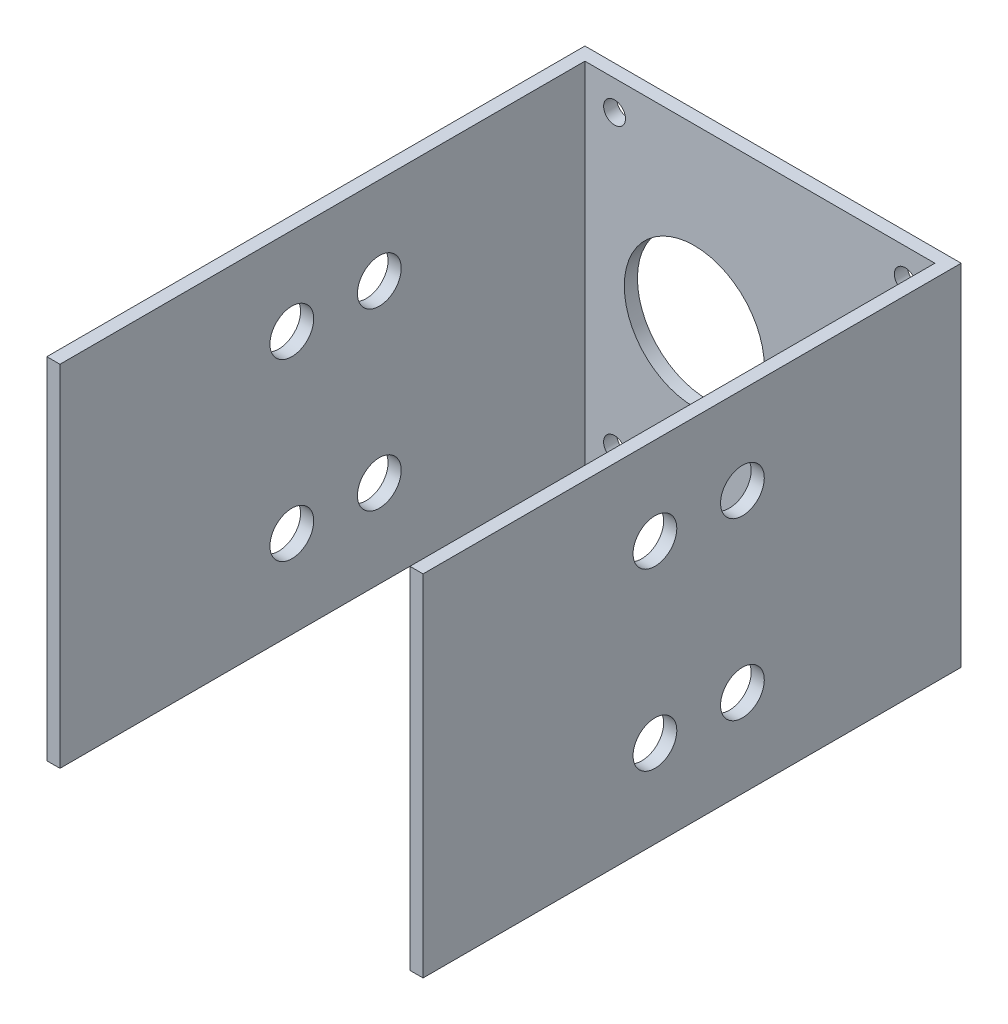
ISO-10303-21;
HEADER;
FILE_DESCRIPTION(('STEP AP214'),'2;1');
FILE_NAME('part.step','',(''),(''),'','','');
FILE_SCHEMA(('AUTOMOTIVE_DESIGN { 1 0 10303 214 1 1 1 1 }'));
ENDSEC;
DATA;
#1=APPLICATION_CONTEXT('core data for automotive mechanical design processes');
#2=APPLICATION_PROTOCOL_DEFINITION('international standard','automotive_design',2000,#1);
#3=PRODUCT_CONTEXT('',#1,'mechanical');
#4=PRODUCT('Part','Part','',(#3));
#5=PRODUCT_RELATED_PRODUCT_CATEGORY('part','',(#4));
#6=PRODUCT_DEFINITION_FORMATION('','',#4);
#7=PRODUCT_DEFINITION_CONTEXT('part definition',#1,'design');
#8=PRODUCT_DEFINITION('design','',#6,#7);
#9=PRODUCT_DEFINITION_SHAPE('','',#8);
#10=(LENGTH_UNIT() NAMED_UNIT(*) SI_UNIT(.MILLI.,.METRE.));
#11=(NAMED_UNIT(*) PLANE_ANGLE_UNIT() SI_UNIT($,.RADIAN.));
#12=(NAMED_UNIT(*) SI_UNIT($,.STERADIAN.) SOLID_ANGLE_UNIT());
#13=UNCERTAINTY_MEASURE_WITH_UNIT(LENGTH_MEASURE(1.E-05),#10,'distance_accuracy_value','');
#14=(GEOMETRIC_REPRESENTATION_CONTEXT(3) GLOBAL_UNCERTAINTY_ASSIGNED_CONTEXT((#13)) GLOBAL_UNIT_ASSIGNED_CONTEXT((#10,
#11,#12)) REPRESENTATION_CONTEXT('',''));
#15=CARTESIAN_POINT('',(0.,0.,0.));
#16=DIRECTION('',(0.,0.,1.));
#17=DIRECTION('',(1.,0.,0.));
#18=AXIS2_PLACEMENT_3D('',#15,#16,#17);
#19=CARTESIAN_POINT('',(0.,0.,3.));
#20=DIRECTION('',(0.,0.,1.));
#21=DIRECTION('',(1.,0.,0.));
#22=AXIS2_PLACEMENT_3D('',#19,#20,#21);
#23=PLANE('',#22);
#24=CARTESIAN_POINT('',(-33.23,33.23,3.));
#25=DIRECTION('',(0.,0.,1.));
#26=DIRECTION('',(1.,0.,0.));
#27=AXIS2_PLACEMENT_3D('',#24,#25,#26);
#28=CIRCLE('',#27,2.5);
#29=CARTESIAN_POINT('',(-30.73,33.23,3.));
#30=VERTEX_POINT('',#29);
#31=EDGE_CURVE('E211',#30,#30,#28,.T.);
#32=ORIENTED_EDGE('',*,*,#31,.F.);
#33=EDGE_LOOP('',(#32));
#34=FACE_BOUND('',#33,.T.);
#35=CARTESIAN_POINT('',(-33.23,-33.23,3.));
#36=DIRECTION('',(0.,0.,1.));
#37=DIRECTION('',(1.,0.,0.));
#38=AXIS2_PLACEMENT_3D('',#35,#36,#37);
#39=CIRCLE('',#38,2.5);
#40=CARTESIAN_POINT('',(-30.73,-33.23,3.));
#41=VERTEX_POINT('',#40);
#42=EDGE_CURVE('E208',#41,#41,#39,.T.);
#43=ORIENTED_EDGE('',*,*,#42,.F.);
#44=EDGE_LOOP('',(#43));
#45=FACE_BOUND('',#44,.T.);
#46=CARTESIAN_POINT('',(33.23,-33.23,3.));
#47=DIRECTION('',(0.,0.,1.));
#48=DIRECTION('',(1.,0.,0.));
#49=AXIS2_PLACEMENT_3D('',#46,#47,#48);
#50=CIRCLE('',#49,2.5);
#51=CARTESIAN_POINT('',(35.73,-33.23,3.));
#52=VERTEX_POINT('',#51);
#53=EDGE_CURVE('E205',#52,#52,#50,.T.);
#54=ORIENTED_EDGE('',*,*,#53,.F.);
#55=EDGE_LOOP('',(#54));
#56=FACE_BOUND('',#55,.T.);
#57=CARTESIAN_POINT('',(33.23,33.23,3.));
#58=DIRECTION('',(0.,0.,1.));
#59=DIRECTION('',(1.,0.,0.));
#60=AXIS2_PLACEMENT_3D('',#57,#58,#59);
#61=CIRCLE('',#60,2.5);
#62=CARTESIAN_POINT('',(35.73,33.23,3.));
#63=VERTEX_POINT('',#62);
#64=EDGE_CURVE('E202',#63,#63,#61,.T.);
#65=ORIENTED_EDGE('',*,*,#64,.F.);
#66=EDGE_LOOP('',(#65));
#67=FACE_BOUND('',#66,.T.);
#68=CARTESIAN_POINT('',(-15.,0.,3.));
#69=DIRECTION('',(0.,0.,1.));
#70=DIRECTION('',(1.,0.,0.));
#71=AXIS2_PLACEMENT_3D('',#68,#69,#70);
#72=CIRCLE('',#71,16.);
#73=CARTESIAN_POINT('',(0.999999999999997,0.,3.));
#74=VERTEX_POINT('',#73);
#75=EDGE_CURVE('E217',#74,#74,#72,.T.);
#76=ORIENTED_EDGE('',*,*,#75,.F.);
#77=EDGE_LOOP('',(#76));
#78=FACE_BOUND('',#77,.T.);
#79=DIRECTION('',(1.,0.,0.));
#80=VECTOR('',#79,1.);
#81=CARTESIAN_POINT('',(-43.,-40.,3.));
#82=LINE('',#81,#80);
#83=CARTESIAN_POINT('',(-40.,-40.,3.));
#84=VERTEX_POINT('',#83);
#85=CARTESIAN_POINT('',(40.,-40.,3.));
#86=VERTEX_POINT('',#85);
#87=EDGE_CURVE('E56',#84,#86,#82,.T.);
#88=ORIENTED_EDGE('',*,*,#87,.T.);
#89=DIRECTION('',(0.,-1.,0.));
#90=VECTOR('',#89,1.);
#91=CARTESIAN_POINT('',(40.,40.,3.));
#92=LINE('',#91,#90);
#93=CARTESIAN_POINT('',(40.,40.,3.));
#94=VERTEX_POINT('',#93);
#95=EDGE_CURVE('E51',#94,#86,#92,.T.);
#96=ORIENTED_EDGE('',*,*,#95,.F.);
#97=DIRECTION('',(-1.,0.,0.));
#98=VECTOR('',#97,1.);
#99=CARTESIAN_POINT('',(-43.,40.,3.));
#100=LINE('',#99,#98);
#101=CARTESIAN_POINT('',(-40.,40.,3.));
#102=VERTEX_POINT('',#101);
#103=EDGE_CURVE('E148',#94,#102,#100,.T.);
#104=ORIENTED_EDGE('',*,*,#103,.T.);
#105=DIRECTION('',(0.,-1.,0.));
#106=VECTOR('',#105,1.);
#107=CARTESIAN_POINT('',(-40.,40.,3.));
#108=LINE('',#107,#106);
#109=EDGE_CURVE('E124',#102,#84,#108,.T.);
#110=ORIENTED_EDGE('',*,*,#109,.T.);
#111=EDGE_LOOP('',(#88,#96,#104,#110));
#112=FACE_BOUND('',#111,.T.);
#113=ADVANCED_FACE('F34',(#34,#45,#56,#67,#78,#112),#23,.T.);
#114=CARTESIAN_POINT('',(43.,40.,3.));
#115=DIRECTION('',(-1.,0.,0.));
#116=DIRECTION('',(0.,-1.,0.));
#117=AXIS2_PLACEMENT_3D('',#114,#115,#116);
#118=PLANE('',#117);
#119=CARTESIAN_POINT('',(43.,-20.,50.));
#120=DIRECTION('',(1.,0.,0.));
#121=DIRECTION('',(0.,1.,0.));
#122=AXIS2_PLACEMENT_3D('',#119,#120,#121);
#123=CIRCLE('',#122,5.);
#124=CARTESIAN_POINT('',(43.,-15.,50.));
#125=VERTEX_POINT('',#124);
#126=EDGE_CURVE('E250',#125,#125,#123,.T.);
#127=ORIENTED_EDGE('',*,*,#126,.F.);
#128=EDGE_LOOP('',(#127));
#129=FACE_BOUND('',#128,.T.);
#130=CARTESIAN_POINT('',(43.,20.,70.));
#131=DIRECTION('',(1.,0.,0.));
#132=DIRECTION('',(0.,1.,0.));
#133=AXIS2_PLACEMENT_3D('',#130,#131,#132);
#134=CIRCLE('',#133,5.);
#135=CARTESIAN_POINT('',(43.,25.,70.));
#136=VERTEX_POINT('',#135);
#137=EDGE_CURVE('E254',#136,#136,#134,.T.);
#138=ORIENTED_EDGE('',*,*,#137,.F.);
#139=EDGE_LOOP('',(#138));
#140=FACE_BOUND('',#139,.T.);
#141=CARTESIAN_POINT('',(43.,-20.,70.));
#142=DIRECTION('',(1.,0.,0.));
#143=DIRECTION('',(0.,1.,0.));
#144=AXIS2_PLACEMENT_3D('',#141,#142,#143);
#145=CIRCLE('',#144,5.);
#146=CARTESIAN_POINT('',(43.,-15.,70.));
#147=VERTEX_POINT('',#146);
#148=EDGE_CURVE('E258',#147,#147,#145,.T.);
#149=ORIENTED_EDGE('',*,*,#148,.F.);
#150=EDGE_LOOP('',(#149));
#151=FACE_BOUND('',#150,.T.);
#152=CARTESIAN_POINT('',(43.,20.,50.));
#153=DIRECTION('',(1.,0.,0.));
#154=DIRECTION('',(0.,1.,0.));
#155=AXIS2_PLACEMENT_3D('',#152,#153,#154);
#156=CIRCLE('',#155,5.);
#157=CARTESIAN_POINT('',(43.,25.,50.));
#158=VERTEX_POINT('',#157);
#159=EDGE_CURVE('E261',#158,#158,#156,.T.);
#160=ORIENTED_EDGE('',*,*,#159,.F.);
#161=EDGE_LOOP('',(#160));
#162=FACE_BOUND('',#161,.T.);
#163=DIRECTION('',(0.,1.,0.));
#164=VECTOR('',#163,1.);
#165=CARTESIAN_POINT('',(43.,40.,0.));
#166=LINE('',#165,#164);
#167=CARTESIAN_POINT('',(43.,-40.,0.));
#168=VERTEX_POINT('',#167);
#169=CARTESIAN_POINT('',(43.,40.,0.));
#170=VERTEX_POINT('',#169);
#171=EDGE_CURVE('E145',#168,#170,#166,.T.);
#172=ORIENTED_EDGE('',*,*,#171,.T.);
#173=DIRECTION('',(0.,0.,-1.));
#174=VECTOR('',#173,1.);
#175=CARTESIAN_POINT('',(43.,40.,3.));
#176=LINE('',#175,#174);
#177=CARTESIAN_POINT('',(43.,40.,123.));
#178=VERTEX_POINT('',#177);
#179=EDGE_CURVE('E11',#178,#170,#176,.T.);
#180=ORIENTED_EDGE('',*,*,#179,.F.);
#181=DIRECTION('',(0.,1.,0.));
#182=VECTOR('',#181,1.);
#183=CARTESIAN_POINT('',(43.,-40.,123.));
#184=LINE('',#183,#182);
#185=CARTESIAN_POINT('',(43.,-40.,123.));
#186=VERTEX_POINT('',#185);
#187=EDGE_CURVE('E122',#186,#178,#184,.T.);
#188=ORIENTED_EDGE('',*,*,#187,.F.);
#189=DIRECTION('',(0.,0.,-1.));
#190=VECTOR('',#189,1.);
#191=CARTESIAN_POINT('',(43.,-40.,3.));
#192=LINE('',#191,#190);
#193=EDGE_CURVE('E120',#186,#168,#192,.T.);
#194=ORIENTED_EDGE('',*,*,#193,.T.);
#195=EDGE_LOOP('',(#172,#180,#188,#194));
#196=FACE_BOUND('',#195,.T.);
#197=ADVANCED_FACE('F36',(#129,#140,#151,#162,#196),#118,.F.);
#198=CARTESIAN_POINT('',(-43.,40.,3.));
#199=DIRECTION('',(0.,-1.,0.));
#200=DIRECTION('',(0.,0.,-1.));
#201=AXIS2_PLACEMENT_3D('',#198,#199,#200);
#202=PLANE('',#201);
#203=DIRECTION('',(-1.,0.,0.));
#204=VECTOR('',#203,1.);
#205=CARTESIAN_POINT('',(-43.,40.,0.));
#206=LINE('',#205,#204);
#207=CARTESIAN_POINT('',(-43.,40.,0.));
#208=VERTEX_POINT('',#207);
#209=EDGE_CURVE('E154',#170,#208,#206,.T.);
#210=ORIENTED_EDGE('',*,*,#209,.T.);
#211=DIRECTION('',(0.,0.,-1.));
#212=VECTOR('',#211,1.);
#213=CARTESIAN_POINT('',(-43.,40.,3.));
#214=LINE('',#213,#212);
#215=CARTESIAN_POINT('',(-43.,40.,123.));
#216=VERTEX_POINT('',#215);
#217=EDGE_CURVE('E43',#216,#208,#214,.T.);
#218=ORIENTED_EDGE('',*,*,#217,.F.);
#219=DIRECTION('',(1.,0.,0.));
#220=VECTOR('',#219,1.);
#221=CARTESIAN_POINT('',(-43.,40.,123.));
#222=LINE('',#221,#220);
#223=CARTESIAN_POINT('',(-40.,40.,123.));
#224=VERTEX_POINT('',#223);
#225=EDGE_CURVE('E135',#216,#224,#222,.T.);
#226=ORIENTED_EDGE('',*,*,#225,.T.);
#227=DIRECTION('',(0.,0.,-1.));
#228=VECTOR('',#227,1.);
#229=CARTESIAN_POINT('',(-40.,40.,123.));
#230=LINE('',#229,#228);
#231=EDGE_CURVE('E141',#224,#102,#230,.T.);
#232=ORIENTED_EDGE('',*,*,#231,.T.);
#233=ORIENTED_EDGE('',*,*,#103,.F.);
#234=DIRECTION('',(0.,0.,-1.));
#235=VECTOR('',#234,1.);
#236=CARTESIAN_POINT('',(40.,40.,123.));
#237=LINE('',#236,#235);
#238=CARTESIAN_POINT('',(40.,40.,123.));
#239=VERTEX_POINT('',#238);
#240=EDGE_CURVE('E116',#239,#94,#237,.T.);
#241=ORIENTED_EDGE('',*,*,#240,.F.);
#242=DIRECTION('',(-1.,0.,0.));
#243=VECTOR('',#242,1.);
#244=CARTESIAN_POINT('',(43.,40.,123.));
#245=LINE('',#244,#243);
#246=EDGE_CURVE('E107',#178,#239,#245,.T.);
#247=ORIENTED_EDGE('',*,*,#246,.F.);
#248=ORIENTED_EDGE('',*,*,#179,.T.);
#249=EDGE_LOOP('',(#210,#218,#226,#232,#233,#241,#247,#248));
#250=FACE_BOUND('',#249,.T.);
#251=ADVANCED_FACE('F221',(#250),#202,.F.);
#252=CARTESIAN_POINT('',(-43.,40.,3.));
#253=DIRECTION('',(1.,0.,0.));
#254=DIRECTION('',(0.,1.,0.));
#255=AXIS2_PLACEMENT_3D('',#252,#253,#254);
#256=PLANE('',#255);
#257=CARTESIAN_POINT('',(-43.,-20.,50.));
#258=DIRECTION('',(1.,0.,0.));
#259=DIRECTION('',(0.,1.,0.));
#260=AXIS2_PLACEMENT_3D('',#257,#258,#259);
#261=CIRCLE('',#260,5.);
#262=CARTESIAN_POINT('',(-43.,-15.,50.));
#263=VERTEX_POINT('',#262);
#264=EDGE_CURVE('E263',#263,#263,#261,.T.);
#265=ORIENTED_EDGE('',*,*,#264,.T.);
#266=EDGE_LOOP('',(#265));
#267=FACE_BOUND('',#266,.T.);
#268=CARTESIAN_POINT('',(-43.,20.,70.));
#269=DIRECTION('',(1.,0.,0.));
#270=DIRECTION('',(0.,1.,0.));
#271=AXIS2_PLACEMENT_3D('',#268,#269,#270);
#272=CIRCLE('',#271,5.);
#273=CARTESIAN_POINT('',(-43.,25.,70.));
#274=VERTEX_POINT('',#273);
#275=EDGE_CURVE('E270',#274,#274,#272,.T.);
#276=ORIENTED_EDGE('',*,*,#275,.T.);
#277=EDGE_LOOP('',(#276));
#278=FACE_BOUND('',#277,.T.);
#279=CARTESIAN_POINT('',(-43.,-20.,70.));
#280=DIRECTION('',(1.,0.,0.));
#281=DIRECTION('',(0.,1.,0.));
#282=AXIS2_PLACEMENT_3D('',#279,#280,#281);
#283=CIRCLE('',#282,5.);
#284=CARTESIAN_POINT('',(-43.,-15.,70.));
#285=VERTEX_POINT('',#284);
#286=EDGE_CURVE('E271',#285,#285,#283,.T.);
#287=ORIENTED_EDGE('',*,*,#286,.T.);
#288=EDGE_LOOP('',(#287));
#289=FACE_BOUND('',#288,.T.);
#290=CARTESIAN_POINT('',(-43.,20.,50.));
#291=DIRECTION('',(1.,0.,0.));
#292=DIRECTION('',(0.,1.,0.));
#293=AXIS2_PLACEMENT_3D('',#290,#291,#292);
#294=CIRCLE('',#293,5.);
#295=CARTESIAN_POINT('',(-43.,25.,50.));
#296=VERTEX_POINT('',#295);
#297=EDGE_CURVE('E169',#296,#296,#294,.T.);
#298=ORIENTED_EDGE('',*,*,#297,.T.);
#299=EDGE_LOOP('',(#298));
#300=FACE_BOUND('',#299,.T.);
#301=DIRECTION('',(0.,-1.,0.));
#302=VECTOR('',#301,1.);
#303=CARTESIAN_POINT('',(-43.,40.,0.));
#304=LINE('',#303,#302);
#305=CARTESIAN_POINT('',(-43.,-40.,0.));
#306=VERTEX_POINT('',#305);
#307=EDGE_CURVE('E156',#208,#306,#304,.T.);
#308=ORIENTED_EDGE('',*,*,#307,.T.);
#309=DIRECTION('',(0.,0.,-1.));
#310=VECTOR('',#309,1.);
#311=CARTESIAN_POINT('',(-43.,-40.,3.));
#312=LINE('',#311,#310);
#313=CARTESIAN_POINT('',(-43.,-40.,123.));
#314=VERTEX_POINT('',#313);
#315=EDGE_CURVE('E160',#314,#306,#312,.T.);
#316=ORIENTED_EDGE('',*,*,#315,.F.);
#317=DIRECTION('',(0.,1.,0.));
#318=VECTOR('',#317,1.);
#319=CARTESIAN_POINT('',(-43.,-40.,123.));
#320=LINE('',#319,#318);
#321=EDGE_CURVE('E132',#314,#216,#320,.T.);
#322=ORIENTED_EDGE('',*,*,#321,.T.);
#323=ORIENTED_EDGE('',*,*,#217,.T.);
#324=EDGE_LOOP('',(#308,#316,#322,#323));
#325=FACE_BOUND('',#324,.T.);
#326=ADVANCED_FACE('F232',(#267,#278,#289,#300,#325),#256,.F.);
#327=CARTESIAN_POINT('',(-43.,-40.,3.));
#328=DIRECTION('',(0.,1.,0.));
#329=DIRECTION('',(0.,0.,1.));
#330=AXIS2_PLACEMENT_3D('',#327,#328,#329);
#331=PLANE('',#330);
#332=DIRECTION('',(1.,0.,0.));
#333=VECTOR('',#332,1.);
#334=CARTESIAN_POINT('',(-43.,-40.,0.));
#335=LINE('',#334,#333);
#336=EDGE_CURVE('E150',#306,#168,#335,.T.);
#337=ORIENTED_EDGE('',*,*,#336,.T.);
#338=ORIENTED_EDGE('',*,*,#193,.F.);
#339=DIRECTION('',(1.,0.,0.));
#340=VECTOR('',#339,1.);
#341=CARTESIAN_POINT('',(40.,-40.,123.));
#342=LINE('',#341,#340);
#343=CARTESIAN_POINT('',(40.,-40.,123.));
#344=VERTEX_POINT('',#343);
#345=EDGE_CURVE('E105',#344,#186,#342,.T.);
#346=ORIENTED_EDGE('',*,*,#345,.F.);
#347=DIRECTION('',(0.,0.,-1.));
#348=VECTOR('',#347,1.);
#349=CARTESIAN_POINT('',(40.,-40.,123.));
#350=LINE('',#349,#348);
#351=EDGE_CURVE('E111',#344,#86,#350,.T.);
#352=ORIENTED_EDGE('',*,*,#351,.T.);
#353=ORIENTED_EDGE('',*,*,#87,.F.);
#354=DIRECTION('',(0.,0.,-1.));
#355=VECTOR('',#354,1.);
#356=CARTESIAN_POINT('',(-40.,-40.,123.));
#357=LINE('',#356,#355);
#358=CARTESIAN_POINT('',(-40.,-40.,123.));
#359=VERTEX_POINT('',#358);
#360=EDGE_CURVE('E143',#359,#84,#357,.T.);
#361=ORIENTED_EDGE('',*,*,#360,.F.);
#362=DIRECTION('',(-1.,0.,0.));
#363=VECTOR('',#362,1.);
#364=CARTESIAN_POINT('',(-40.,-40.,123.));
#365=LINE('',#364,#363);
#366=EDGE_CURVE('E129',#359,#314,#365,.T.);
#367=ORIENTED_EDGE('',*,*,#366,.T.);
#368=ORIENTED_EDGE('',*,*,#315,.T.);
#369=EDGE_LOOP('',(#337,#338,#346,#352,#353,#361,#367,#368));
#370=FACE_BOUND('',#369,.T.);
#371=ADVANCED_FACE('F118',(#370),#331,.F.);
#372=CARTESIAN_POINT('',(0.,0.,0.));
#373=DIRECTION('',(0.,0.,1.));
#374=DIRECTION('',(1.,0.,0.));
#375=AXIS2_PLACEMENT_3D('',#372,#373,#374);
#376=PLANE('',#375);
#377=CARTESIAN_POINT('',(-33.23,33.23,0.));
#378=DIRECTION('',(0.,0.,-1.));
#379=DIRECTION('',(-1.,0.,0.));
#380=AXIS2_PLACEMENT_3D('',#377,#378,#379);
#381=CIRCLE('',#380,2.5);
#382=CARTESIAN_POINT('',(-35.73,33.23,0.));
#383=VERTEX_POINT('',#382);
#384=EDGE_CURVE('E190',#383,#383,#381,.T.);
#385=ORIENTED_EDGE('',*,*,#384,.F.);
#386=EDGE_LOOP('',(#385));
#387=FACE_BOUND('',#386,.T.);
#388=CARTESIAN_POINT('',(-33.23,-33.23,0.));
#389=DIRECTION('',(0.,0.,-1.));
#390=DIRECTION('',(-1.,0.,0.));
#391=AXIS2_PLACEMENT_3D('',#388,#389,#390);
#392=CIRCLE('',#391,2.5);
#393=CARTESIAN_POINT('',(-35.73,-33.23,0.));
#394=VERTEX_POINT('',#393);
#395=EDGE_CURVE('E195',#394,#394,#392,.T.);
#396=ORIENTED_EDGE('',*,*,#395,.F.);
#397=EDGE_LOOP('',(#396));
#398=FACE_BOUND('',#397,.T.);
#399=CARTESIAN_POINT('',(33.23,-33.23,0.));
#400=DIRECTION('',(0.,0.,-1.));
#401=DIRECTION('',(-1.,0.,0.));
#402=AXIS2_PLACEMENT_3D('',#399,#400,#401);
#403=CIRCLE('',#402,2.5);
#404=CARTESIAN_POINT('',(30.73,-33.23,0.));
#405=VERTEX_POINT('',#404);
#406=EDGE_CURVE('E191',#405,#405,#403,.T.);
#407=ORIENTED_EDGE('',*,*,#406,.F.);
#408=EDGE_LOOP('',(#407));
#409=FACE_BOUND('',#408,.T.);
#410=CARTESIAN_POINT('',(33.23,33.23,0.));
#411=DIRECTION('',(0.,0.,-1.));
#412=DIRECTION('',(-1.,0.,0.));
#413=AXIS2_PLACEMENT_3D('',#410,#411,#412);
#414=CIRCLE('',#413,2.5);
#415=CARTESIAN_POINT('',(30.73,33.23,0.));
#416=VERTEX_POINT('',#415);
#417=EDGE_CURVE('E194',#416,#416,#414,.T.);
#418=ORIENTED_EDGE('',*,*,#417,.F.);
#419=EDGE_LOOP('',(#418));
#420=FACE_BOUND('',#419,.T.);
#421=CARTESIAN_POINT('',(-15.,0.,0.));
#422=DIRECTION('',(0.,0.,-1.));
#423=DIRECTION('',(-1.,0.,0.));
#424=AXIS2_PLACEMENT_3D('',#421,#422,#423);
#425=CIRCLE('',#424,16.);
#426=CARTESIAN_POINT('',(-31.,0.,0.));
#427=VERTEX_POINT('',#426);
#428=EDGE_CURVE('E214',#427,#427,#425,.T.);
#429=ORIENTED_EDGE('',*,*,#428,.F.);
#430=EDGE_LOOP('',(#429));
#431=FACE_BOUND('',#430,.T.);
#432=ORIENTED_EDGE('',*,*,#171,.F.);
#433=ORIENTED_EDGE('',*,*,#336,.F.);
#434=ORIENTED_EDGE('',*,*,#307,.F.);
#435=ORIENTED_EDGE('',*,*,#209,.F.);
#436=EDGE_LOOP('',(#432,#433,#434,#435));
#437=FACE_BOUND('',#436,.T.);
#438=ADVANCED_FACE('F237',(#387,#398,#409,#420,#431,#437),#376,.F.);
#439=CARTESIAN_POINT('',(-40.,40.,123.));
#440=DIRECTION('',(1.,0.,0.));
#441=DIRECTION('',(0.,1.,0.));
#442=AXIS2_PLACEMENT_3D('',#439,#440,#441);
#443=PLANE('',#442);
#444=CARTESIAN_POINT('',(-40.,-20.,50.));
#445=DIRECTION('',(1.,0.,0.));
#446=DIRECTION('',(0.,1.,0.));
#447=AXIS2_PLACEMENT_3D('',#444,#445,#446);
#448=CIRCLE('',#447,5.);
#449=CARTESIAN_POINT('',(-40.,-15.,50.));
#450=VERTEX_POINT('',#449);
#451=EDGE_CURVE('E187',#450,#450,#448,.T.);
#452=ORIENTED_EDGE('',*,*,#451,.F.);
#453=EDGE_LOOP('',(#452));
#454=FACE_BOUND('',#453,.T.);
#455=CARTESIAN_POINT('',(-40.,20.,70.));
#456=DIRECTION('',(1.,0.,0.));
#457=DIRECTION('',(0.,1.,0.));
#458=AXIS2_PLACEMENT_3D('',#455,#456,#457);
#459=CIRCLE('',#458,5.);
#460=CARTESIAN_POINT('',(-40.,25.,70.));
#461=VERTEX_POINT('',#460);
#462=EDGE_CURVE('E175',#461,#461,#459,.T.);
#463=ORIENTED_EDGE('',*,*,#462,.F.);
#464=EDGE_LOOP('',(#463));
#465=FACE_BOUND('',#464,.T.);
#466=CARTESIAN_POINT('',(-40.,-20.,70.));
#467=DIRECTION('',(1.,0.,0.));
#468=DIRECTION('',(0.,1.,0.));
#469=AXIS2_PLACEMENT_3D('',#466,#467,#468);
#470=CIRCLE('',#469,5.);
#471=CARTESIAN_POINT('',(-40.,-15.,70.));
#472=VERTEX_POINT('',#471);
#473=EDGE_CURVE('E172',#472,#472,#470,.T.);
#474=ORIENTED_EDGE('',*,*,#473,.F.);
#475=EDGE_LOOP('',(#474));
#476=FACE_BOUND('',#475,.T.);
#477=CARTESIAN_POINT('',(-40.,20.,50.));
#478=DIRECTION('',(1.,0.,0.));
#479=DIRECTION('',(0.,1.,0.));
#480=AXIS2_PLACEMENT_3D('',#477,#478,#479);
#481=CIRCLE('',#480,5.);
#482=CARTESIAN_POINT('',(-40.,25.,50.));
#483=VERTEX_POINT('',#482);
#484=EDGE_CURVE('E168',#483,#483,#481,.T.);
#485=ORIENTED_EDGE('',*,*,#484,.F.);
#486=EDGE_LOOP('',(#485));
#487=FACE_BOUND('',#486,.T.);
#488=ORIENTED_EDGE('',*,*,#109,.F.);
#489=ORIENTED_EDGE('',*,*,#231,.F.);
#490=DIRECTION('',(0.,-1.,0.));
#491=VECTOR('',#490,1.);
#492=CARTESIAN_POINT('',(-40.,40.,123.));
#493=LINE('',#492,#491);
#494=EDGE_CURVE('E138',#224,#359,#493,.T.);
#495=ORIENTED_EDGE('',*,*,#494,.T.);
#496=ORIENTED_EDGE('',*,*,#360,.T.);
#497=EDGE_LOOP('',(#488,#489,#495,#496));
#498=FACE_BOUND('',#497,.T.);
#499=ADVANCED_FACE('F230',(#454,#465,#476,#487,#498),#443,.T.);
#500=CARTESIAN_POINT('',(0.,0.,123.));
#501=DIRECTION('',(0.,0.,-1.));
#502=DIRECTION('',(-1.,0.,0.));
#503=AXIS2_PLACEMENT_3D('',#500,#501,#502);
#504=PLANE('',#503);
#505=ORIENTED_EDGE('',*,*,#366,.F.);
#506=ORIENTED_EDGE('',*,*,#494,.F.);
#507=ORIENTED_EDGE('',*,*,#225,.F.);
#508=ORIENTED_EDGE('',*,*,#321,.F.);
#509=EDGE_LOOP('',(#505,#506,#507,#508));
#510=FACE_BOUND('',#509,.T.);
#511=ADVANCED_FACE('F228',(#510),#504,.F.);
#512=CARTESIAN_POINT('',(40.,40.,123.));
#513=DIRECTION('',(1.,0.,0.));
#514=DIRECTION('',(0.,1.,0.));
#515=AXIS2_PLACEMENT_3D('',#512,#513,#514);
#516=PLANE('',#515);
#517=CARTESIAN_POINT('',(40.,-20.,50.));
#518=DIRECTION('',(1.,0.,0.));
#519=DIRECTION('',(0.,1.,0.));
#520=AXIS2_PLACEMENT_3D('',#517,#518,#519);
#521=CIRCLE('',#520,5.);
#522=CARTESIAN_POINT('',(40.,-15.,50.));
#523=VERTEX_POINT('',#522);
#524=EDGE_CURVE('E38',#523,#523,#521,.T.);
#525=ORIENTED_EDGE('',*,*,#524,.T.);
#526=EDGE_LOOP('',(#525));
#527=FACE_BOUND('',#526,.T.);
#528=CARTESIAN_POINT('',(40.,20.,70.));
#529=DIRECTION('',(1.,0.,0.));
#530=DIRECTION('',(0.,1.,0.));
#531=AXIS2_PLACEMENT_3D('',#528,#529,#530);
#532=CIRCLE('',#531,5.);
#533=CARTESIAN_POINT('',(40.,25.,70.));
#534=VERTEX_POINT('',#533);
#535=EDGE_CURVE('E173',#534,#534,#532,.T.);
#536=ORIENTED_EDGE('',*,*,#535,.T.);
#537=EDGE_LOOP('',(#536));
#538=FACE_BOUND('',#537,.T.);
#539=CARTESIAN_POINT('',(40.,-20.,70.));
#540=DIRECTION('',(1.,0.,0.));
#541=DIRECTION('',(0.,1.,0.));
#542=AXIS2_PLACEMENT_3D('',#539,#540,#541);
#543=CIRCLE('',#542,5.);
#544=CARTESIAN_POINT('',(40.,-15.,70.));
#545=VERTEX_POINT('',#544);
#546=EDGE_CURVE('E170',#545,#545,#543,.T.);
#547=ORIENTED_EDGE('',*,*,#546,.T.);
#548=EDGE_LOOP('',(#547));
#549=FACE_BOUND('',#548,.T.);
#550=CARTESIAN_POINT('',(40.,20.,50.));
#551=DIRECTION('',(1.,0.,0.));
#552=DIRECTION('',(0.,1.,0.));
#553=AXIS2_PLACEMENT_3D('',#550,#551,#552);
#554=CIRCLE('',#553,5.);
#555=CARTESIAN_POINT('',(40.,25.,50.));
#556=VERTEX_POINT('',#555);
#557=EDGE_CURVE('E165',#556,#556,#554,.T.);
#558=ORIENTED_EDGE('',*,*,#557,.T.);
#559=EDGE_LOOP('',(#558));
#560=FACE_BOUND('',#559,.T.);
#561=ORIENTED_EDGE('',*,*,#95,.T.);
#562=ORIENTED_EDGE('',*,*,#351,.F.);
#563=DIRECTION('',(0.,-1.,0.));
#564=VECTOR('',#563,1.);
#565=CARTESIAN_POINT('',(40.,40.,123.));
#566=LINE('',#565,#564);
#567=EDGE_CURVE('E100',#239,#344,#566,.T.);
#568=ORIENTED_EDGE('',*,*,#567,.F.);
#569=ORIENTED_EDGE('',*,*,#240,.T.);
#570=EDGE_LOOP('',(#561,#562,#568,#569));
#571=FACE_BOUND('',#570,.T.);
#572=ADVANCED_FACE('F114',(#527,#538,#549,#560,#571),#516,.F.);
#573=CARTESIAN_POINT('',(0.,0.,123.));
#574=DIRECTION('',(0.,0.,1.));
#575=DIRECTION('',(1.,0.,0.));
#576=AXIS2_PLACEMENT_3D('',#573,#574,#575);
#577=PLANE('',#576);
#578=ORIENTED_EDGE('',*,*,#345,.T.);
#579=ORIENTED_EDGE('',*,*,#187,.T.);
#580=ORIENTED_EDGE('',*,*,#246,.T.);
#581=ORIENTED_EDGE('',*,*,#567,.T.);
#582=EDGE_LOOP('',(#578,#579,#580,#581));
#583=FACE_BOUND('',#582,.T.);
#584=ADVANCED_FACE('F102',(#583),#577,.T.);
#585=CARTESIAN_POINT('',(-15.,0.,120.));
#586=DIRECTION('',(0.,0.,-1.));
#587=DIRECTION('',(-1.,0.,0.));
#588=AXIS2_PLACEMENT_3D('',#585,#586,#587);
#589=CYLINDRICAL_SURFACE('',#588,16.);
#590=ORIENTED_EDGE('',*,*,#75,.T.);
#591=EDGE_LOOP('',(#590));
#592=FACE_BOUND('',#591,.T.);
#593=ORIENTED_EDGE('',*,*,#428,.T.);
#594=EDGE_LOOP('',(#593));
#595=FACE_BOUND('',#594,.T.);
#596=ADVANCED_FACE('F321',(#592,#595),#589,.F.);
#597=CARTESIAN_POINT('',(33.23,33.23,120.));
#598=DIRECTION('',(0.,0.,-1.));
#599=DIRECTION('',(-1.,0.,0.));
#600=AXIS2_PLACEMENT_3D('',#597,#598,#599);
#601=CYLINDRICAL_SURFACE('',#600,2.5);
#602=ORIENTED_EDGE('',*,*,#64,.T.);
#603=EDGE_LOOP('',(#602));
#604=FACE_BOUND('',#603,.T.);
#605=ORIENTED_EDGE('',*,*,#417,.T.);
#606=EDGE_LOOP('',(#605));
#607=FACE_BOUND('',#606,.T.);
#608=ADVANCED_FACE('F418',(#604,#607),#601,.F.);
#609=CARTESIAN_POINT('',(33.23,-33.23,120.));
#610=DIRECTION('',(0.,0.,-1.));
#611=DIRECTION('',(-1.,0.,0.));
#612=AXIS2_PLACEMENT_3D('',#609,#610,#611);
#613=CYLINDRICAL_SURFACE('',#612,2.5);
#614=ORIENTED_EDGE('',*,*,#53,.T.);
#615=EDGE_LOOP('',(#614));
#616=FACE_BOUND('',#615,.T.);
#617=ORIENTED_EDGE('',*,*,#406,.T.);
#618=EDGE_LOOP('',(#617));
#619=FACE_BOUND('',#618,.T.);
#620=ADVANCED_FACE('F409',(#616,#619),#613,.F.);
#621=CARTESIAN_POINT('',(-33.23,-33.23,120.));
#622=DIRECTION('',(0.,0.,-1.));
#623=DIRECTION('',(-1.,0.,0.));
#624=AXIS2_PLACEMENT_3D('',#621,#622,#623);
#625=CYLINDRICAL_SURFACE('',#624,2.5);
#626=ORIENTED_EDGE('',*,*,#42,.T.);
#627=EDGE_LOOP('',(#626));
#628=FACE_BOUND('',#627,.T.);
#629=ORIENTED_EDGE('',*,*,#395,.T.);
#630=EDGE_LOOP('',(#629));
#631=FACE_BOUND('',#630,.T.);
#632=ADVANCED_FACE('F400',(#628,#631),#625,.F.);
#633=CARTESIAN_POINT('',(-33.23,33.23,120.));
#634=DIRECTION('',(0.,0.,-1.));
#635=DIRECTION('',(-1.,0.,0.));
#636=AXIS2_PLACEMENT_3D('',#633,#634,#635);
#637=CYLINDRICAL_SURFACE('',#636,2.5);
#638=ORIENTED_EDGE('',*,*,#31,.T.);
#639=EDGE_LOOP('',(#638));
#640=FACE_BOUND('',#639,.T.);
#641=ORIENTED_EDGE('',*,*,#384,.T.);
#642=EDGE_LOOP('',(#641));
#643=FACE_BOUND('',#642,.T.);
#644=ADVANCED_FACE('F307',(#640,#643),#637,.F.);
#645=CARTESIAN_POINT('',(-43.,20.,50.));
#646=DIRECTION('',(1.,0.,0.));
#647=DIRECTION('',(0.,1.,0.));
#648=AXIS2_PLACEMENT_3D('',#645,#646,#647);
#649=CYLINDRICAL_SURFACE('',#648,5.);
#650=ORIENTED_EDGE('',*,*,#159,.T.);
#651=EDGE_LOOP('',(#650));
#652=FACE_BOUND('',#651,.T.);
#653=ORIENTED_EDGE('',*,*,#557,.F.);
#654=EDGE_LOOP('',(#653));
#655=FACE_BOUND('',#654,.T.);
#656=ADVANCED_FACE('F298',(#652,#655),#649,.F.);
#657=CARTESIAN_POINT('',(-43.,-20.,70.));
#658=DIRECTION('',(1.,0.,0.));
#659=DIRECTION('',(0.,1.,0.));
#660=AXIS2_PLACEMENT_3D('',#657,#658,#659);
#661=CYLINDRICAL_SURFACE('',#660,5.);
#662=ORIENTED_EDGE('',*,*,#148,.T.);
#663=EDGE_LOOP('',(#662));
#664=FACE_BOUND('',#663,.T.);
#665=ORIENTED_EDGE('',*,*,#546,.F.);
#666=EDGE_LOOP('',(#665));
#667=FACE_BOUND('',#666,.T.);
#668=ADVANCED_FACE('F286',(#664,#667),#661,.F.);
#669=CARTESIAN_POINT('',(-43.,20.,70.));
#670=DIRECTION('',(1.,0.,0.));
#671=DIRECTION('',(0.,1.,0.));
#672=AXIS2_PLACEMENT_3D('',#669,#670,#671);
#673=CYLINDRICAL_SURFACE('',#672,5.);
#674=ORIENTED_EDGE('',*,*,#137,.T.);
#675=EDGE_LOOP('',(#674));
#676=FACE_BOUND('',#675,.T.);
#677=ORIENTED_EDGE('',*,*,#535,.F.);
#678=EDGE_LOOP('',(#677));
#679=FACE_BOUND('',#678,.T.);
#680=ADVANCED_FACE('F294',(#676,#679),#673,.F.);
#681=CARTESIAN_POINT('',(-43.,-20.,50.));
#682=DIRECTION('',(1.,0.,0.));
#683=DIRECTION('',(0.,1.,0.));
#684=AXIS2_PLACEMENT_3D('',#681,#682,#683);
#685=CYLINDRICAL_SURFACE('',#684,5.);
#686=ORIENTED_EDGE('',*,*,#126,.T.);
#687=EDGE_LOOP('',(#686));
#688=FACE_BOUND('',#687,.T.);
#689=ORIENTED_EDGE('',*,*,#524,.F.);
#690=EDGE_LOOP('',(#689));
#691=FACE_BOUND('',#690,.T.);
#692=ADVANCED_FACE('F295',(#688,#691),#685,.F.);
#693=ORIENTED_EDGE('',*,*,#484,.T.);
#694=EDGE_LOOP('',(#693));
#695=FACE_BOUND('',#694,.T.);
#696=ORIENTED_EDGE('',*,*,#297,.F.);
#697=EDGE_LOOP('',(#696));
#698=FACE_BOUND('',#697,.T.);
#699=ADVANCED_FACE('F284',(#695,#698),#649,.F.);
#700=ORIENTED_EDGE('',*,*,#473,.T.);
#701=EDGE_LOOP('',(#700));
#702=FACE_BOUND('',#701,.T.);
#703=ORIENTED_EDGE('',*,*,#286,.F.);
#704=EDGE_LOOP('',(#703));
#705=FACE_BOUND('',#704,.T.);
#706=ADVANCED_FACE('F281',(#702,#705),#661,.F.);
#707=ORIENTED_EDGE('',*,*,#462,.T.);
#708=EDGE_LOOP('',(#707));
#709=FACE_BOUND('',#708,.T.);
#710=ORIENTED_EDGE('',*,*,#275,.F.);
#711=EDGE_LOOP('',(#710));
#712=FACE_BOUND('',#711,.T.);
#713=ADVANCED_FACE('F283',(#709,#712),#673,.F.);
#714=ORIENTED_EDGE('',*,*,#451,.T.);
#715=EDGE_LOOP('',(#714));
#716=FACE_BOUND('',#715,.T.);
#717=ORIENTED_EDGE('',*,*,#264,.F.);
#718=EDGE_LOOP('',(#717));
#719=FACE_BOUND('',#718,.T.);
#720=ADVANCED_FACE('F291',(#716,#719),#685,.F.);
#721=CLOSED_SHELL('',(#113,#197,#251,#326,#371,#438,#499,#511,#572,#584,#596,#608,#620,#632,
#644,#656,#668,#680,#692,#699,#706,#713,#720));
#722=MANIFOLD_SOLID_BREP('B2',#721);
#723=ADVANCED_BREP_SHAPE_REPRESENTATION('',(#18,#722),#14);
#724=SHAPE_DEFINITION_REPRESENTATION(#9,#723);
ENDSEC;
END-ISO-10303-21;
